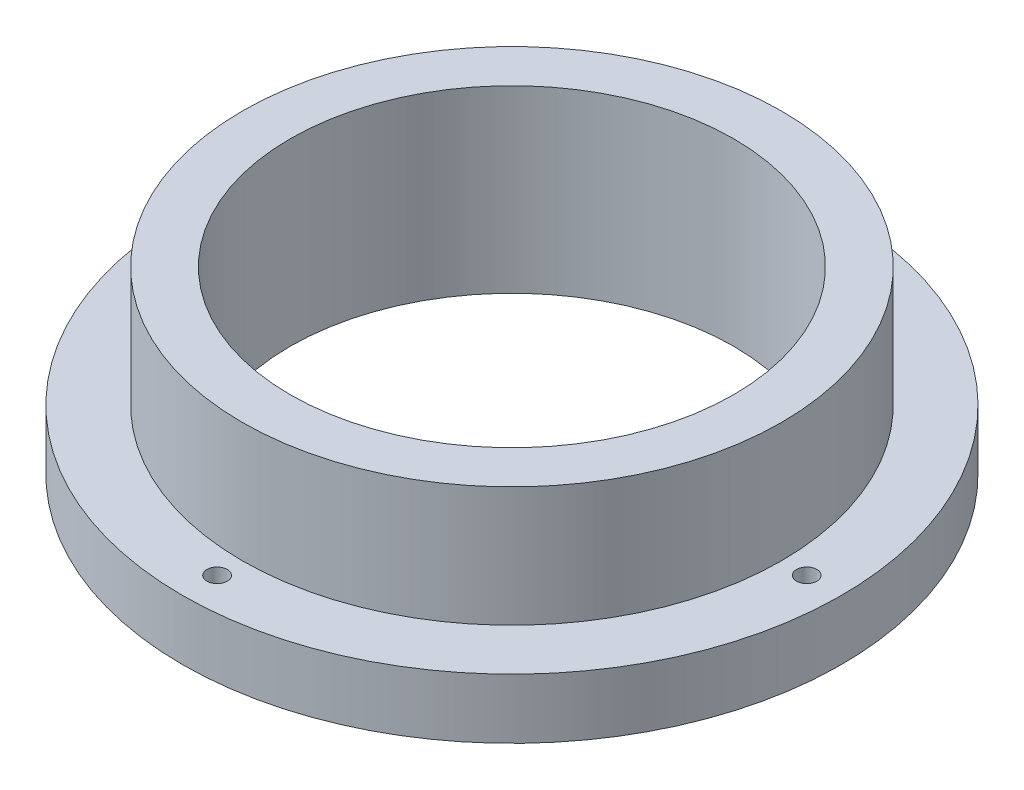
ISO-10303-21;
HEADER;
FILE_DESCRIPTION(('STEP AP214'),'2;1');
FILE_NAME('part.step','',(''),(''),'','','');
FILE_SCHEMA(('AUTOMOTIVE_DESIGN { 1 0 10303 214 1 1 1 1 }'));
ENDSEC;
DATA;
#1=APPLICATION_CONTEXT('core data for automotive mechanical design processes');
#2=APPLICATION_PROTOCOL_DEFINITION('international standard','automotive_design',2000,#1);
#3=PRODUCT_CONTEXT('',#1,'mechanical');
#4=PRODUCT('Part','Part','',(#3));
#5=PRODUCT_RELATED_PRODUCT_CATEGORY('part','',(#4));
#6=PRODUCT_DEFINITION_FORMATION('','',#4);
#7=PRODUCT_DEFINITION_CONTEXT('part definition',#1,'design');
#8=PRODUCT_DEFINITION('design','',#6,#7);
#9=PRODUCT_DEFINITION_SHAPE('','',#8);
#10=(LENGTH_UNIT() NAMED_UNIT(*) SI_UNIT(.MILLI.,.METRE.));
#11=(NAMED_UNIT(*) PLANE_ANGLE_UNIT() SI_UNIT($,.RADIAN.));
#12=(NAMED_UNIT(*) SI_UNIT($,.STERADIAN.) SOLID_ANGLE_UNIT());
#13=UNCERTAINTY_MEASURE_WITH_UNIT(LENGTH_MEASURE(1.E-05),#10,'distance_accuracy_value','');
#14=(GEOMETRIC_REPRESENTATION_CONTEXT(3) GLOBAL_UNCERTAINTY_ASSIGNED_CONTEXT((#13)) GLOBAL_UNIT_ASSIGNED_CONTEXT((#10,
#11,#12)) REPRESENTATION_CONTEXT('',''));
#15=CARTESIAN_POINT('',(0.,0.,0.));
#16=DIRECTION('',(0.,0.,1.));
#17=DIRECTION('',(1.,0.,0.));
#18=AXIS2_PLACEMENT_3D('',#15,#16,#17);
#19=CARTESIAN_POINT('',(0.,5.,0.));
#20=DIRECTION('',(0.,1.,0.));
#21=DIRECTION('',(0.,0.,1.));
#22=AXIS2_PLACEMENT_3D('',#19,#20,#21);
#23=PLANE('',#22);
#24=CARTESIAN_POINT('',(0.,5.,0.));
#25=DIRECTION('',(0.,1.,0.));
#26=DIRECTION('',(0.,0.,1.));
#27=AXIS2_PLACEMENT_3D('',#24,#25,#26);
#28=CIRCLE('',#27,22.5);
#29=CARTESIAN_POINT('',(0.,5.,22.5));
#30=VERTEX_POINT('',#29);
#31=EDGE_CURVE('E68',#30,#30,#28,.T.);
#32=ORIENTED_EDGE('',*,*,#31,.F.);
#33=EDGE_LOOP('',(#32));
#34=FACE_BOUND('',#33,.T.);
#35=CARTESIAN_POINT('',(1.39232284172407E-12,5.,24.6));
#36=DIRECTION('',(0.,1.,0.));
#37=DIRECTION('',(0.,0.,1.));
#38=AXIS2_PLACEMENT_3D('',#35,#36,#37);
#39=CIRCLE('',#38,0.850000000001495);
#40=CARTESIAN_POINT('',(1.39232284172407E-12,5.,25.4500000000015));
#41=VERTEX_POINT('',#40);
#42=EDGE_CURVE('E53',#41,#41,#39,.T.);
#43=ORIENTED_EDGE('',*,*,#42,.F.);
#44=EDGE_LOOP('',(#43));
#45=FACE_BOUND('',#44,.T.);
#46=CARTESIAN_POINT('',(0.,5.,-24.6));
#47=DIRECTION('',(0.,1.,0.));
#48=DIRECTION('',(0.,0.,1.));
#49=AXIS2_PLACEMENT_3D('',#46,#47,#48);
#50=CIRCLE('',#49,0.85);
#51=CARTESIAN_POINT('',(0.,5.,-23.75));
#52=VERTEX_POINT('',#51);
#53=EDGE_CURVE('E42',#52,#52,#50,.T.);
#54=ORIENTED_EDGE('',*,*,#53,.F.);
#55=EDGE_LOOP('',(#54));
#56=FACE_BOUND('',#55,.T.);
#57=CARTESIAN_POINT('',(0.,5.,0.));
#58=DIRECTION('',(0.,1.,0.));
#59=DIRECTION('',(0.,0.,1.));
#60=AXIS2_PLACEMENT_3D('',#57,#58,#59);
#61=CIRCLE('',#60,27.5);
#62=CARTESIAN_POINT('',(0.,5.,27.5));
#63=VERTEX_POINT('',#62);
#64=EDGE_CURVE('E10',#63,#63,#61,.T.);
#65=ORIENTED_EDGE('',*,*,#64,.T.);
#66=EDGE_LOOP('',(#65));
#67=FACE_BOUND('',#66,.T.);
#68=CARTESIAN_POINT('',(24.6000000000007,5.,-6.96161420862036E-13));
#69=DIRECTION('',(0.,1.,0.));
#70=DIRECTION('',(0.,0.,1.));
#71=AXIS2_PLACEMENT_3D('',#68,#69,#70);
#72=CIRCLE('',#71,0.850000000000545);
#73=CARTESIAN_POINT('',(24.6000000000007,5.,0.849999999999849));
#74=VERTEX_POINT('',#73);
#75=EDGE_CURVE('E47',#74,#74,#72,.T.);
#76=ORIENTED_EDGE('',*,*,#75,.F.);
#77=EDGE_LOOP('',(#76));
#78=FACE_BOUND('',#77,.T.);
#79=CARTESIAN_POINT('',(-24.5999999999993,5.,6.99174051987939E-13));
#80=DIRECTION('',(0.,1.,0.));
#81=DIRECTION('',(0.,0.,1.));
#82=AXIS2_PLACEMENT_3D('',#79,#80,#81);
#83=CIRCLE('',#82,0.850000000001117);
#84=CARTESIAN_POINT('',(-24.5999999999993,5.,0.850000000001817));
#85=VERTEX_POINT('',#84);
#86=EDGE_CURVE('E59',#85,#85,#83,.T.);
#87=ORIENTED_EDGE('',*,*,#86,.F.);
#88=EDGE_LOOP('',(#87));
#89=FACE_BOUND('',#88,.T.);
#90=ADVANCED_FACE('F31',(#34,#45,#56,#67,#78,#89),#23,.T.);
#91=CARTESIAN_POINT('',(0.,0.,0.));
#92=DIRECTION('',(0.,1.,0.));
#93=DIRECTION('',(0.,0.,1.));
#94=AXIS2_PLACEMENT_3D('',#91,#92,#93);
#95=PLANE('',#94);
#96=CARTESIAN_POINT('',(0.,0.,0.));
#97=DIRECTION('',(0.,1.,0.));
#98=DIRECTION('',(0.,0.,1.));
#99=AXIS2_PLACEMENT_3D('',#96,#97,#98);
#100=CIRCLE('',#99,18.5);
#101=CARTESIAN_POINT('',(0.,0.,18.5));
#102=VERTEX_POINT('',#101);
#103=EDGE_CURVE('E71',#102,#102,#100,.T.);
#104=ORIENTED_EDGE('',*,*,#103,.T.);
#105=EDGE_LOOP('',(#104));
#106=FACE_BOUND('',#105,.T.);
#107=CARTESIAN_POINT('',(0.,0.,0.));
#108=DIRECTION('',(0.,1.,0.));
#109=DIRECTION('',(0.,0.,1.));
#110=AXIS2_PLACEMENT_3D('',#107,#108,#109);
#111=CIRCLE('',#110,27.5);
#112=CARTESIAN_POINT('',(0.,0.,27.5));
#113=VERTEX_POINT('',#112);
#114=EDGE_CURVE('E35',#113,#113,#111,.T.);
#115=ORIENTED_EDGE('',*,*,#114,.F.);
#116=EDGE_LOOP('',(#115));
#117=FACE_BOUND('',#116,.T.);
#118=CARTESIAN_POINT('',(0.,0.,-24.6));
#119=DIRECTION('',(0.,1.,0.));
#120=DIRECTION('',(0.,0.,1.));
#121=AXIS2_PLACEMENT_3D('',#118,#119,#120);
#122=CIRCLE('',#121,0.85);
#123=CARTESIAN_POINT('',(0.,0.,-23.75));
#124=VERTEX_POINT('',#123);
#125=EDGE_CURVE('E44',#124,#124,#122,.T.);
#126=ORIENTED_EDGE('',*,*,#125,.T.);
#127=EDGE_LOOP('',(#126));
#128=FACE_BOUND('',#127,.T.);
#129=CARTESIAN_POINT('',(24.6000000000007,0.,-6.96161420862036E-13));
#130=DIRECTION('',(0.,1.,0.));
#131=DIRECTION('',(0.,0.,1.));
#132=AXIS2_PLACEMENT_3D('',#129,#130,#131);
#133=CIRCLE('',#132,0.850000000000545);
#134=CARTESIAN_POINT('',(24.6000000000007,0.,0.849999999999849));
#135=VERTEX_POINT('',#134);
#136=EDGE_CURVE('E50',#135,#135,#133,.T.);
#137=ORIENTED_EDGE('',*,*,#136,.T.);
#138=EDGE_LOOP('',(#137));
#139=FACE_BOUND('',#138,.T.);
#140=CARTESIAN_POINT('',(1.39232284172407E-12,0.,24.6));
#141=DIRECTION('',(0.,1.,0.));
#142=DIRECTION('',(0.,0.,1.));
#143=AXIS2_PLACEMENT_3D('',#140,#141,#142);
#144=CIRCLE('',#143,0.850000000001495);
#145=CARTESIAN_POINT('',(1.39232284172407E-12,0.,25.4500000000015));
#146=VERTEX_POINT('',#145);
#147=EDGE_CURVE('E56',#146,#146,#144,.T.);
#148=ORIENTED_EDGE('',*,*,#147,.T.);
#149=EDGE_LOOP('',(#148));
#150=FACE_BOUND('',#149,.T.);
#151=CARTESIAN_POINT('',(-24.5999999999993,0.,6.99174051987939E-13));
#152=DIRECTION('',(0.,1.,0.));
#153=DIRECTION('',(0.,0.,1.));
#154=AXIS2_PLACEMENT_3D('',#151,#152,#153);
#155=CIRCLE('',#154,0.850000000001117);
#156=CARTESIAN_POINT('',(-24.5999999999993,0.,0.850000000001817));
#157=VERTEX_POINT('',#156);
#158=EDGE_CURVE('E62',#157,#157,#155,.T.);
#159=ORIENTED_EDGE('',*,*,#158,.T.);
#160=EDGE_LOOP('',(#159));
#161=FACE_BOUND('',#160,.T.);
#162=ADVANCED_FACE('F80',(#106,#117,#128,#139,#150,#161),#95,.F.);
#163=CARTESIAN_POINT('',(0.,5.,0.));
#164=DIRECTION('',(0.,-1.,0.));
#165=DIRECTION('',(0.,0.,-1.));
#166=AXIS2_PLACEMENT_3D('',#163,#164,#165);
#167=CYLINDRICAL_SURFACE('',#166,27.5);
#168=ORIENTED_EDGE('',*,*,#64,.F.);
#169=EDGE_LOOP('',(#168));
#170=FACE_BOUND('',#169,.T.);
#171=ORIENTED_EDGE('',*,*,#114,.T.);
#172=EDGE_LOOP('',(#171));
#173=FACE_BOUND('',#172,.T.);
#174=ADVANCED_FACE('F33',(#170,#173),#167,.T.);
#175=CARTESIAN_POINT('',(0.,5.,-24.6));
#176=DIRECTION('',(0.,-1.,0.));
#177=DIRECTION('',(0.,0.,-1.));
#178=AXIS2_PLACEMENT_3D('',#175,#176,#177);
#179=CYLINDRICAL_SURFACE('',#178,0.85);
#180=ORIENTED_EDGE('',*,*,#53,.T.);
#181=EDGE_LOOP('',(#180));
#182=FACE_BOUND('',#181,.T.);
#183=ORIENTED_EDGE('',*,*,#125,.F.);
#184=EDGE_LOOP('',(#183));
#185=FACE_BOUND('',#184,.T.);
#186=ADVANCED_FACE('F123',(#182,#185),#179,.F.);
#187=CARTESIAN_POINT('',(24.6000000000007,5.,-6.96161420862036E-13));
#188=DIRECTION('',(0.,-1.,0.));
#189=DIRECTION('',(0.,0.,-1.));
#190=AXIS2_PLACEMENT_3D('',#187,#188,#189);
#191=CYLINDRICAL_SURFACE('',#190,0.850000000000545);
#192=ORIENTED_EDGE('',*,*,#75,.T.);
#193=EDGE_LOOP('',(#192));
#194=FACE_BOUND('',#193,.T.);
#195=ORIENTED_EDGE('',*,*,#136,.F.);
#196=EDGE_LOOP('',(#195));
#197=FACE_BOUND('',#196,.T.);
#198=ADVANCED_FACE('F128',(#194,#197),#191,.F.);
#199=CARTESIAN_POINT('',(1.39232284172407E-12,5.,24.6));
#200=DIRECTION('',(0.,-1.,0.));
#201=DIRECTION('',(0.,0.,-1.));
#202=AXIS2_PLACEMENT_3D('',#199,#200,#201);
#203=CYLINDRICAL_SURFACE('',#202,0.850000000001495);
#204=ORIENTED_EDGE('',*,*,#42,.T.);
#205=EDGE_LOOP('',(#204));
#206=FACE_BOUND('',#205,.T.);
#207=ORIENTED_EDGE('',*,*,#147,.F.);
#208=EDGE_LOOP('',(#207));
#209=FACE_BOUND('',#208,.T.);
#210=ADVANCED_FACE('F115',(#206,#209),#203,.F.);
#211=CARTESIAN_POINT('',(-24.5999999999993,5.,6.99174051987939E-13));
#212=DIRECTION('',(0.,-1.,0.));
#213=DIRECTION('',(0.,0.,-1.));
#214=AXIS2_PLACEMENT_3D('',#211,#212,#213);
#215=CYLINDRICAL_SURFACE('',#214,0.850000000001117);
#216=ORIENTED_EDGE('',*,*,#86,.T.);
#217=EDGE_LOOP('',(#216));
#218=FACE_BOUND('',#217,.T.);
#219=ORIENTED_EDGE('',*,*,#158,.F.);
#220=EDGE_LOOP('',(#219));
#221=FACE_BOUND('',#220,.T.);
#222=ADVANCED_FACE('F98',(#218,#221),#215,.F.);
#223=CARTESIAN_POINT('',(0.,15.,0.));
#224=DIRECTION('',(0.,-1.,0.));
#225=DIRECTION('',(0.,0.,-1.));
#226=AXIS2_PLACEMENT_3D('',#223,#224,#225);
#227=CYLINDRICAL_SURFACE('',#226,22.5);
#228=CARTESIAN_POINT('',(0.,15.,0.));
#229=DIRECTION('',(0.,1.,0.));
#230=DIRECTION('',(0.,0.,1.));
#231=AXIS2_PLACEMENT_3D('',#228,#229,#230);
#232=CIRCLE('',#231,22.5);
#233=CARTESIAN_POINT('',(0.,15.,22.5));
#234=VERTEX_POINT('',#233);
#235=EDGE_CURVE('E65',#234,#234,#232,.T.);
#236=ORIENTED_EDGE('',*,*,#235,.F.);
#237=EDGE_LOOP('',(#236));
#238=FACE_BOUND('',#237,.T.);
#239=ORIENTED_EDGE('',*,*,#31,.T.);
#240=EDGE_LOOP('',(#239));
#241=FACE_BOUND('',#240,.T.);
#242=ADVANCED_FACE('F92',(#238,#241),#227,.T.);
#243=CARTESIAN_POINT('',(0.,15.,0.));
#244=DIRECTION('',(0.,1.,0.));
#245=DIRECTION('',(0.,0.,1.));
#246=AXIS2_PLACEMENT_3D('',#243,#244,#245);
#247=PLANE('',#246);
#248=CARTESIAN_POINT('',(0.,15.,0.));
#249=DIRECTION('',(0.,1.,0.));
#250=DIRECTION('',(0.,0.,1.));
#251=AXIS2_PLACEMENT_3D('',#248,#249,#250);
#252=CIRCLE('',#251,18.5);
#253=CARTESIAN_POINT('',(0.,15.,18.5));
#254=VERTEX_POINT('',#253);
#255=EDGE_CURVE('E74',#254,#254,#252,.T.);
#256=ORIENTED_EDGE('',*,*,#255,.F.);
#257=EDGE_LOOP('',(#256));
#258=FACE_BOUND('',#257,.T.);
#259=ORIENTED_EDGE('',*,*,#235,.T.);
#260=EDGE_LOOP('',(#259));
#261=FACE_BOUND('',#260,.T.);
#262=ADVANCED_FACE('F86',(#258,#261),#247,.T.);
#263=CARTESIAN_POINT('',(0.,0.,0.));
#264=DIRECTION('',(0.,1.,0.));
#265=DIRECTION('',(0.,0.,1.));
#266=AXIS2_PLACEMENT_3D('',#263,#264,#265);
#267=CYLINDRICAL_SURFACE('',#266,18.5);
#268=ORIENTED_EDGE('',*,*,#103,.F.);
#269=EDGE_LOOP('',(#268));
#270=FACE_BOUND('',#269,.T.);
#271=ORIENTED_EDGE('',*,*,#255,.T.);
#272=EDGE_LOOP('',(#271));
#273=FACE_BOUND('',#272,.T.);
#274=ADVANCED_FACE('F83',(#270,#273),#267,.F.);
#275=CLOSED_SHELL('',(#90,#162,#174,#186,#198,#210,#222,#242,#262,#274));
#276=MANIFOLD_SOLID_BREP('B2',#275);
#277=ADVANCED_BREP_SHAPE_REPRESENTATION('',(#18,#276),#14);
#278=SHAPE_DEFINITION_REPRESENTATION(#9,#277);
ENDSEC;
END-ISO-10303-21;
